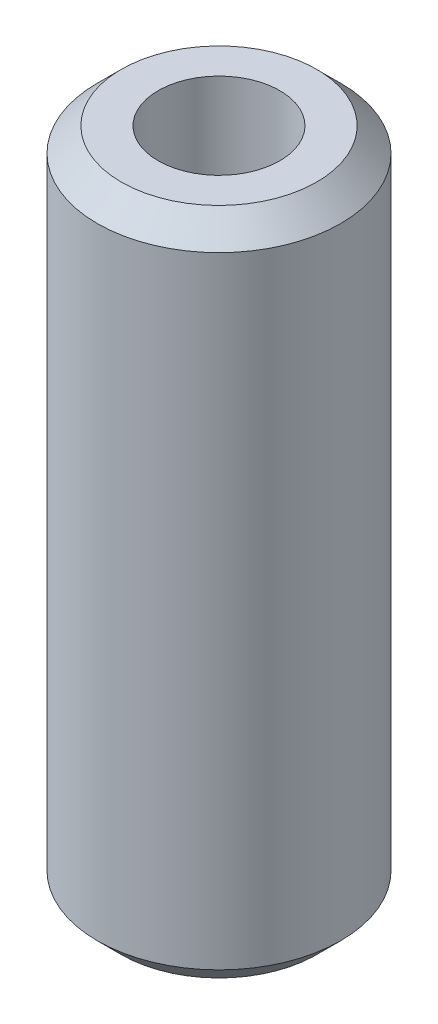
ISO-10303-21;
HEADER;
FILE_DESCRIPTION(('STEP AP214'),'2;1');
FILE_NAME('part.step','',(''),(''),'','','');
FILE_SCHEMA(('AUTOMOTIVE_DESIGN { 1 0 10303 214 1 1 1 1 }'));
ENDSEC;
DATA;
#1=APPLICATION_CONTEXT('core data for automotive mechanical design processes');
#2=APPLICATION_PROTOCOL_DEFINITION('international standard','automotive_design',2000,#1);
#3=PRODUCT_CONTEXT('',#1,'mechanical');
#4=PRODUCT('Part','Part','',(#3));
#5=PRODUCT_RELATED_PRODUCT_CATEGORY('part','',(#4));
#6=PRODUCT_DEFINITION_FORMATION('','',#4);
#7=PRODUCT_DEFINITION_CONTEXT('part definition',#1,'design');
#8=PRODUCT_DEFINITION('design','',#6,#7);
#9=PRODUCT_DEFINITION_SHAPE('','',#8);
#10=(LENGTH_UNIT() NAMED_UNIT(*) SI_UNIT(.MILLI.,.METRE.));
#11=(NAMED_UNIT(*) PLANE_ANGLE_UNIT() SI_UNIT($,.RADIAN.));
#12=(NAMED_UNIT(*) SI_UNIT($,.STERADIAN.) SOLID_ANGLE_UNIT());
#13=UNCERTAINTY_MEASURE_WITH_UNIT(LENGTH_MEASURE(1.E-05),#10,'distance_accuracy_value','');
#14=(GEOMETRIC_REPRESENTATION_CONTEXT(3) GLOBAL_UNCERTAINTY_ASSIGNED_CONTEXT((#13)) GLOBAL_UNIT_ASSIGNED_CONTEXT((#10,
#11,#12)) REPRESENTATION_CONTEXT('',''));
#15=CARTESIAN_POINT('',(0.,0.,0.));
#16=DIRECTION('',(0.,0.,1.));
#17=DIRECTION('',(1.,0.,0.));
#18=AXIS2_PLACEMENT_3D('',#15,#16,#17);
#19=CARTESIAN_POINT('',(0.,34.925,0.));
#20=DIRECTION('',(0.,1.,0.));
#21=DIRECTION('',(0.,0.,1.));
#22=AXIS2_PLACEMENT_3D('',#19,#20,#21);
#23=PLANE('',#22);
#24=CARTESIAN_POINT('',(0.,34.925,0.));
#25=DIRECTION('',(0.,1.,0.));
#26=DIRECTION('',(0.,0.,1.));
#27=AXIS2_PLACEMENT_3D('',#24,#25,#26);
#28=CIRCLE('',#27,10.2);
#29=CARTESIAN_POINT('',(0.,34.925,10.2));
#30=VERTEX_POINT('',#29);
#31=EDGE_CURVE('E10',#30,#30,#28,.T.);
#32=ORIENTED_EDGE('',*,*,#31,.T.);
#33=EDGE_LOOP('',(#32));
#34=FACE_BOUND('',#33,.T.);
#35=CARTESIAN_POINT('',(0.,34.925,0.));
#36=DIRECTION('',(0.,1.,0.));
#37=DIRECTION('',(0.,0.,1.));
#38=AXIS2_PLACEMENT_3D('',#35,#36,#37);
#39=CIRCLE('',#38,6.35);
#40=CARTESIAN_POINT('',(0.,34.925,6.35));
#41=VERTEX_POINT('',#40);
#42=EDGE_CURVE('E64',#41,#41,#39,.T.);
#43=ORIENTED_EDGE('',*,*,#42,.F.);
#44=EDGE_LOOP('',(#43));
#45=FACE_BOUND('',#44,.T.);
#46=ADVANCED_FACE('F39',(#34,#45),#23,.T.);
#47=CARTESIAN_POINT('',(0.,-34.925,0.));
#48=DIRECTION('',(0.,1.,0.));
#49=DIRECTION('',(0.,0.,1.));
#50=AXIS2_PLACEMENT_3D('',#47,#48,#49);
#51=PLANE('',#50);
#52=CARTESIAN_POINT('',(0.,-34.925,0.));
#53=DIRECTION('',(0.,1.,0.));
#54=DIRECTION('',(0.,0.,1.));
#55=AXIS2_PLACEMENT_3D('',#52,#53,#54);
#56=CIRCLE('',#55,10.2);
#57=CARTESIAN_POINT('',(0.,-34.925,10.2));
#58=VERTEX_POINT('',#57);
#59=EDGE_CURVE('E48',#58,#58,#56,.F.);
#60=ORIENTED_EDGE('',*,*,#59,.T.);
#61=EDGE_LOOP('',(#60));
#62=FACE_BOUND('',#61,.T.);
#63=CARTESIAN_POINT('',(0.,-34.925,0.));
#64=DIRECTION('',(0.,1.,0.));
#65=DIRECTION('',(0.,0.,1.));
#66=AXIS2_PLACEMENT_3D('',#63,#64,#65);
#67=CIRCLE('',#66,6.35);
#68=CARTESIAN_POINT('',(0.,-34.925,6.35));
#69=VERTEX_POINT('',#68);
#70=EDGE_CURVE('E65',#69,#69,#67,.T.);
#71=ORIENTED_EDGE('',*,*,#70,.T.);
#72=EDGE_LOOP('',(#71));
#73=FACE_BOUND('',#72,.T.);
#74=ADVANCED_FACE('F77',(#62,#73),#51,.F.);
#75=CARTESIAN_POINT('',(0.,34.925,0.));
#76=DIRECTION('',(0.,-1.,0.));
#77=DIRECTION('',(0.,0.,-1.));
#78=AXIS2_PLACEMENT_3D('',#75,#76,#77);
#79=CYLINDRICAL_SURFACE('',#78,12.7);
#80=CARTESIAN_POINT('',(0.,-32.425,0.));
#81=DIRECTION('',(0.,1.,0.));
#82=DIRECTION('',(0.,0.,1.));
#83=AXIS2_PLACEMENT_3D('',#80,#81,#82);
#84=CIRCLE('',#83,12.7);
#85=CARTESIAN_POINT('',(0.,-32.425,12.7));
#86=VERTEX_POINT('',#85);
#87=EDGE_CURVE('E53',#86,#86,#84,.T.);
#88=ORIENTED_EDGE('',*,*,#87,.T.);
#89=EDGE_LOOP('',(#88));
#90=FACE_BOUND('',#89,.T.);
#91=CARTESIAN_POINT('',(0.,32.425,0.));
#92=DIRECTION('',(0.,1.,0.));
#93=DIRECTION('',(0.,0.,1.));
#94=AXIS2_PLACEMENT_3D('',#91,#92,#93);
#95=CIRCLE('',#94,12.7);
#96=CARTESIAN_POINT('',(0.,32.425,12.7));
#97=VERTEX_POINT('',#96);
#98=EDGE_CURVE('E58',#97,#97,#95,.F.);
#99=ORIENTED_EDGE('',*,*,#98,.T.);
#100=EDGE_LOOP('',(#99));
#101=FACE_BOUND('',#100,.T.);
#102=ADVANCED_FACE('F82',(#90,#101),#79,.T.);
#103=CARTESIAN_POINT('',(0.,34.925,0.));
#104=DIRECTION('',(0.,-1.,0.));
#105=DIRECTION('',(0.,0.,-1.));
#106=AXIS2_PLACEMENT_3D('',#103,#104,#105);
#107=CYLINDRICAL_SURFACE('',#106,6.35);
#108=ORIENTED_EDGE('',*,*,#42,.T.);
#109=EDGE_LOOP('',(#108));
#110=FACE_BOUND('',#109,.T.);
#111=ORIENTED_EDGE('',*,*,#70,.F.);
#112=EDGE_LOOP('',(#111));
#113=FACE_BOUND('',#112,.T.);
#114=ADVANCED_FACE('F73',(#110,#113),#107,.F.);
#115=CARTESIAN_POINT('',(0.,-32.425,0.));
#116=DIRECTION('',(0.,1.,0.));
#117=DIRECTION('',(0.,0.,1.));
#118=AXIS2_PLACEMENT_3D('',#115,#116,#117);
#119=CONICAL_SURFACE('',#118,12.7,0.785398163397449);
#120=ORIENTED_EDGE('',*,*,#59,.F.);
#121=EDGE_LOOP('',(#120));
#122=FACE_BOUND('',#121,.T.);
#123=ORIENTED_EDGE('',*,*,#87,.F.);
#124=EDGE_LOOP('',(#123));
#125=FACE_BOUND('',#124,.T.);
#126=ADVANCED_FACE('F89',(#122,#125),#119,.T.);
#127=CARTESIAN_POINT('',(0.,34.925,0.));
#128=DIRECTION('',(0.,-1.,0.));
#129=DIRECTION('',(0.,0.,-1.));
#130=AXIS2_PLACEMENT_3D('',#127,#128,#129);
#131=CONICAL_SURFACE('',#130,10.2,0.785398163397446);
#132=ORIENTED_EDGE('',*,*,#98,.F.);
#133=EDGE_LOOP('',(#132));
#134=FACE_BOUND('',#133,.T.);
#135=ORIENTED_EDGE('',*,*,#31,.F.);
#136=EDGE_LOOP('',(#135));
#137=FACE_BOUND('',#136,.T.);
#138=ADVANCED_FACE('F42',(#134,#137),#131,.T.);
#139=CLOSED_SHELL('',(#46,#74,#102,#114,#126,#138));
#140=MANIFOLD_SOLID_BREP('B2',#139);
#141=ADVANCED_BREP_SHAPE_REPRESENTATION('',(#18,#140),#14);
#142=SHAPE_DEFINITION_REPRESENTATION(#9,#141);
ENDSEC;
END-ISO-10303-21;
